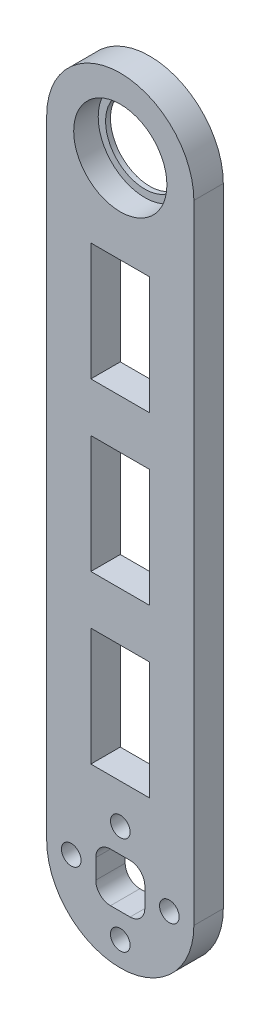
ISO-10303-21;
HEADER;
FILE_DESCRIPTION(('STEP AP214'),'2;1');
FILE_NAME('part.step','',(''),(''),'','','');
FILE_SCHEMA(('AUTOMOTIVE_DESIGN { 1 0 10303 214 1 1 1 1 }'));
ENDSEC;
DATA;
#1=APPLICATION_CONTEXT('core data for automotive mechanical design processes');
#2=APPLICATION_PROTOCOL_DEFINITION('international standard','automotive_design',2000,#1);
#3=PRODUCT_CONTEXT('',#1,'mechanical');
#4=PRODUCT('Part','Part','',(#3));
#5=PRODUCT_RELATED_PRODUCT_CATEGORY('part','',(#4));
#6=PRODUCT_DEFINITION_FORMATION('','',#4);
#7=PRODUCT_DEFINITION_CONTEXT('part definition',#1,'design');
#8=PRODUCT_DEFINITION('design','',#6,#7);
#9=PRODUCT_DEFINITION_SHAPE('','',#8);
#10=(LENGTH_UNIT() NAMED_UNIT(*) SI_UNIT(.MILLI.,.METRE.));
#11=(NAMED_UNIT(*) PLANE_ANGLE_UNIT() SI_UNIT($,.RADIAN.));
#12=(NAMED_UNIT(*) SI_UNIT($,.STERADIAN.) SOLID_ANGLE_UNIT());
#13=UNCERTAINTY_MEASURE_WITH_UNIT(LENGTH_MEASURE(1.E-05),#10,'distance_accuracy_value','');
#14=(GEOMETRIC_REPRESENTATION_CONTEXT(3) GLOBAL_UNCERTAINTY_ASSIGNED_CONTEXT((#13)) GLOBAL_UNIT_ASSIGNED_CONTEXT((#10,
#11,#12)) REPRESENTATION_CONTEXT('',''));
#15=CARTESIAN_POINT('',(0.,0.,0.));
#16=DIRECTION('',(0.,0.,1.));
#17=DIRECTION('',(1.,0.,0.));
#18=AXIS2_PLACEMENT_3D('',#15,#16,#17);
#19=CARTESIAN_POINT('',(0.,64.,6.));
#20=DIRECTION('',(0.,0.,-1.));
#21=DIRECTION('',(-1.,0.,0.));
#22=AXIS2_PLACEMENT_3D('',#19,#20,#21);
#23=CYLINDRICAL_SURFACE('',#22,9.5);
#24=CARTESIAN_POINT('',(0.,64.,6.));
#25=DIRECTION('',(0.,0.,1.));
#26=DIRECTION('',(1.,0.,0.));
#27=AXIS2_PLACEMENT_3D('',#24,#25,#26);
#28=CIRCLE('',#27,9.5);
#29=CARTESIAN_POINT('',(9.5,64.,6.));
#30=VERTEX_POINT('',#29);
#31=EDGE_CURVE('E356',#30,#30,#28,.T.);
#32=ORIENTED_EDGE('',*,*,#31,.T.);
#33=EDGE_LOOP('',(#32));
#34=FACE_BOUND('',#33,.T.);
#35=CARTESIAN_POINT('',(0.,64.,1.));
#36=DIRECTION('',(0.,0.,-1.));
#37=DIRECTION('',(-1.,0.,0.));
#38=AXIS2_PLACEMENT_3D('',#35,#36,#37);
#39=CIRCLE('',#38,9.5);
#40=CARTESIAN_POINT('',(-9.5,64.,1.));
#41=VERTEX_POINT('',#40);
#42=EDGE_CURVE('E234',#41,#41,#39,.T.);
#43=ORIENTED_EDGE('',*,*,#42,.T.);
#44=EDGE_LOOP('',(#43));
#45=FACE_BOUND('',#44,.T.);
#46=ADVANCED_FACE('F41',(#34,#45),#23,.F.);
#47=CARTESIAN_POINT('',(0.,64.,6.));
#48=DIRECTION('',(0.,0.,1.));
#49=DIRECTION('',(1.,0.,0.));
#50=AXIS2_PLACEMENT_3D('',#47,#48,#49);
#51=PLANE('',#50);
#52=DIRECTION('',(0.,1.,0.));
#53=VECTOR('',#52,1.);
#54=CARTESIAN_POINT('',(6.00000000000324,46.,6.));
#55=LINE('',#54,#53);
#56=CARTESIAN_POINT('',(6.00000000000325,22.,6.));
#57=VERTEX_POINT('',#56);
#58=CARTESIAN_POINT('',(6.00000000000324,46.,6.));
#59=VERTEX_POINT('',#58);
#60=EDGE_CURVE('E210',#57,#59,#55,.T.);
#61=ORIENTED_EDGE('',*,*,#60,.F.);
#62=DIRECTION('',(1.,0.,0.));
#63=VECTOR('',#62,1.);
#64=CARTESIAN_POINT('',(-5.99999999999675,22.,6.));
#65=LINE('',#64,#63);
#66=CARTESIAN_POINT('',(-5.99999999999675,22.,6.));
#67=VERTEX_POINT('',#66);
#68=EDGE_CURVE('E228',#67,#57,#65,.T.);
#69=ORIENTED_EDGE('',*,*,#68,.F.);
#70=DIRECTION('',(0.,-1.,0.));
#71=VECTOR('',#70,1.);
#72=CARTESIAN_POINT('',(-5.99999999999676,46.,6.));
#73=LINE('',#72,#71);
#74=CARTESIAN_POINT('',(-5.99999999999676,46.,6.));
#75=VERTEX_POINT('',#74);
#76=EDGE_CURVE('E231',#75,#67,#73,.T.);
#77=ORIENTED_EDGE('',*,*,#76,.F.);
#78=DIRECTION('',(-1.,0.,0.));
#79=VECTOR('',#78,1.);
#80=CARTESIAN_POINT('',(-5.99999999999676,46.,6.));
#81=LINE('',#80,#79);
#82=EDGE_CURVE('E240',#59,#75,#81,.T.);
#83=ORIENTED_EDGE('',*,*,#82,.F.);
#84=EDGE_LOOP('',(#61,#69,#77,#83));
#85=FACE_BOUND('',#84,.T.);
#86=DIRECTION('',(0.,1.,0.));
#87=VECTOR('',#86,1.);
#88=CARTESIAN_POINT('',(6.,12.,6.));
#89=LINE('',#88,#87);
#90=CARTESIAN_POINT('',(6.,-12.,6.));
#91=VERTEX_POINT('',#90);
#92=CARTESIAN_POINT('',(6.,12.,6.));
#93=VERTEX_POINT('',#92);
#94=EDGE_CURVE('E265',#91,#93,#89,.T.);
#95=ORIENTED_EDGE('',*,*,#94,.F.);
#96=DIRECTION('',(1.,0.,0.));
#97=VECTOR('',#96,1.);
#98=CARTESIAN_POINT('',(-6.,-12.,6.));
#99=LINE('',#98,#97);
#100=CARTESIAN_POINT('',(-6.,-12.,6.));
#101=VERTEX_POINT('',#100);
#102=EDGE_CURVE('E255',#101,#91,#99,.T.);
#103=ORIENTED_EDGE('',*,*,#102,.F.);
#104=DIRECTION('',(0.,-1.,0.));
#105=VECTOR('',#104,1.);
#106=CARTESIAN_POINT('',(-6.,12.,6.));
#107=LINE('',#106,#105);
#108=CARTESIAN_POINT('',(-6.,12.,6.));
#109=VERTEX_POINT('',#108);
#110=EDGE_CURVE('E271',#109,#101,#107,.T.);
#111=ORIENTED_EDGE('',*,*,#110,.F.);
#112=DIRECTION('',(-1.,0.,0.));
#113=VECTOR('',#112,1.);
#114=CARTESIAN_POINT('',(-6.,12.,6.));
#115=LINE('',#114,#113);
#116=EDGE_CURVE('E267',#93,#109,#115,.T.);
#117=ORIENTED_EDGE('',*,*,#116,.F.);
#118=EDGE_LOOP('',(#95,#103,#111,#117));
#119=FACE_BOUND('',#118,.T.);
#120=DIRECTION('',(0.,1.,0.));
#121=VECTOR('',#120,1.);
#122=CARTESIAN_POINT('',(6.00000000000325,-22.,6.));
#123=LINE('',#122,#121);
#124=CARTESIAN_POINT('',(6.00000000000325,-46.,6.));
#125=VERTEX_POINT('',#124);
#126=CARTESIAN_POINT('',(6.00000000000325,-22.,6.));
#127=VERTEX_POINT('',#126);
#128=EDGE_CURVE('E297',#125,#127,#123,.T.);
#129=ORIENTED_EDGE('',*,*,#128,.F.);
#130=DIRECTION('',(1.,0.,0.));
#131=VECTOR('',#130,1.);
#132=CARTESIAN_POINT('',(-5.99999999999675,-46.,6.));
#133=LINE('',#132,#131);
#134=CARTESIAN_POINT('',(-5.99999999999675,-46.,6.));
#135=VERTEX_POINT('',#134);
#136=EDGE_CURVE('E287',#135,#125,#133,.T.);
#137=ORIENTED_EDGE('',*,*,#136,.F.);
#138=DIRECTION('',(0.,-1.,0.));
#139=VECTOR('',#138,1.);
#140=CARTESIAN_POINT('',(-5.99999999999675,-22.,6.));
#141=LINE('',#140,#139);
#142=CARTESIAN_POINT('',(-5.99999999999675,-22.,6.));
#143=VERTEX_POINT('',#142);
#144=EDGE_CURVE('E303',#143,#135,#141,.T.);
#145=ORIENTED_EDGE('',*,*,#144,.F.);
#146=DIRECTION('',(-1.,0.,0.));
#147=VECTOR('',#146,1.);
#148=CARTESIAN_POINT('',(-5.99999999999675,-22.,6.));
#149=LINE('',#148,#147);
#150=EDGE_CURVE('E299',#127,#143,#149,.T.);
#151=ORIENTED_EDGE('',*,*,#150,.F.);
#152=EDGE_LOOP('',(#129,#137,#145,#151));
#153=FACE_BOUND('',#152,.T.);
#154=DIRECTION('',(0.,1.,0.));
#155=VECTOR('',#154,1.);
#156=CARTESIAN_POINT('',(5.,-69.,6.));
#157=LINE('',#156,#155);
#158=CARTESIAN_POINT('',(5.,-66.,6.));
#159=VERTEX_POINT('',#158);
#160=CARTESIAN_POINT('',(5.,-62.,6.));
#161=VERTEX_POINT('',#160);
#162=EDGE_CURVE('E325',#159,#161,#157,.T.);
#163=ORIENTED_EDGE('',*,*,#162,.F.);
#164=CARTESIAN_POINT('',(2.,-66.,6.));
#165=DIRECTION('',(0.,0.,1.));
#166=DIRECTION('',(1.,0.,0.));
#167=AXIS2_PLACEMENT_3D('',#164,#165,#166);
#168=CIRCLE('',#167,3.);
#169=CARTESIAN_POINT('',(2.,-69.,6.));
#170=VERTEX_POINT('',#169);
#171=EDGE_CURVE('E414',#159,#170,#168,.F.);
#172=ORIENTED_EDGE('',*,*,#171,.T.);
#173=DIRECTION('',(1.,0.,0.));
#174=VECTOR('',#173,1.);
#175=CARTESIAN_POINT('',(-5.,-69.,6.));
#176=LINE('',#175,#174);
#177=CARTESIAN_POINT('',(-2.,-69.,6.));
#178=VERTEX_POINT('',#177);
#179=EDGE_CURVE('E318',#178,#170,#176,.T.);
#180=ORIENTED_EDGE('',*,*,#179,.F.);
#181=CARTESIAN_POINT('',(-2.,-66.,6.));
#182=DIRECTION('',(0.,0.,1.));
#183=DIRECTION('',(1.,0.,0.));
#184=AXIS2_PLACEMENT_3D('',#181,#182,#183);
#185=CIRCLE('',#184,3.);
#186=CARTESIAN_POINT('',(-5.,-66.,6.));
#187=VERTEX_POINT('',#186);
#188=EDGE_CURVE('E410',#178,#187,#185,.F.);
#189=ORIENTED_EDGE('',*,*,#188,.T.);
#190=DIRECTION('',(0.,-1.,0.));
#191=VECTOR('',#190,1.);
#192=CARTESIAN_POINT('',(-5.,-69.,6.));
#193=LINE('',#192,#191);
#194=CARTESIAN_POINT('',(-5.,-62.,6.));
#195=VERTEX_POINT('',#194);
#196=EDGE_CURVE('E330',#195,#187,#193,.T.);
#197=ORIENTED_EDGE('',*,*,#196,.F.);
#198=CARTESIAN_POINT('',(-2.,-62.,6.));
#199=DIRECTION('',(0.,0.,1.));
#200=DIRECTION('',(1.,0.,0.));
#201=AXIS2_PLACEMENT_3D('',#198,#199,#200);
#202=CIRCLE('',#201,3.);
#203=CARTESIAN_POINT('',(-2.,-59.,6.));
#204=VERTEX_POINT('',#203);
#205=EDGE_CURVE('E49',#195,#204,#202,.F.);
#206=ORIENTED_EDGE('',*,*,#205,.T.);
#207=DIRECTION('',(-1.,0.,0.));
#208=VECTOR('',#207,1.);
#209=CARTESIAN_POINT('',(-5.,-59.,6.));
#210=LINE('',#209,#208);
#211=CARTESIAN_POINT('',(2.,-59.,6.));
#212=VERTEX_POINT('',#211);
#213=EDGE_CURVE('E328',#212,#204,#210,.T.);
#214=ORIENTED_EDGE('',*,*,#213,.F.);
#215=CARTESIAN_POINT('',(2.,-62.,6.));
#216=DIRECTION('',(0.,0.,1.));
#217=DIRECTION('',(1.,0.,0.));
#218=AXIS2_PLACEMENT_3D('',#215,#216,#217);
#219=CIRCLE('',#218,3.);
#220=EDGE_CURVE('E418',#212,#161,#219,.F.);
#221=ORIENTED_EDGE('',*,*,#220,.T.);
#222=EDGE_LOOP('',(#163,#172,#180,#189,#197,#206,#214,#221));
#223=FACE_BOUND('',#222,.T.);
#224=CARTESIAN_POINT('',(2.09488880330588E-13,-74.,6.));
#225=DIRECTION('',(0.,0.,1.));
#226=DIRECTION('',(1.,0.,0.));
#227=AXIS2_PLACEMENT_3D('',#224,#225,#226);
#228=CIRCLE('',#227,2.);
#229=CARTESIAN_POINT('',(2.00000000000021,-74.,6.));
#230=VERTEX_POINT('',#229);
#231=EDGE_CURVE('E341',#230,#230,#228,.T.);
#232=ORIENTED_EDGE('',*,*,#231,.F.);
#233=EDGE_LOOP('',(#232));
#234=FACE_BOUND('',#233,.T.);
#235=CARTESIAN_POINT('',(0.,-54.,6.));
#236=DIRECTION('',(0.,0.,1.));
#237=DIRECTION('',(1.,0.,0.));
#238=AXIS2_PLACEMENT_3D('',#235,#236,#237);
#239=CIRCLE('',#238,2.);
#240=CARTESIAN_POINT('',(2.,-54.,6.));
#241=VERTEX_POINT('',#240);
#242=EDGE_CURVE('E353',#241,#241,#239,.T.);
#243=ORIENTED_EDGE('',*,*,#242,.F.);
#244=EDGE_LOOP('',(#243));
#245=FACE_BOUND('',#244,.T.);
#246=CARTESIAN_POINT('',(0.,64.,6.));
#247=DIRECTION('',(0.,0.,1.));
#248=DIRECTION('',(1.,0.,0.));
#249=AXIS2_PLACEMENT_3D('',#246,#247,#248);
#250=CIRCLE('',#249,15.);
#251=CARTESIAN_POINT('',(15.,64.,6.));
#252=VERTEX_POINT('',#251);
#253=CARTESIAN_POINT('',(-15.,64.,6.));
#254=VERTEX_POINT('',#253);
#255=EDGE_CURVE('E362',#252,#254,#250,.T.);
#256=ORIENTED_EDGE('',*,*,#255,.T.);
#257=DIRECTION('',(0.,-1.,0.));
#258=VECTOR('',#257,1.);
#259=CARTESIAN_POINT('',(-15.,-64.,6.));
#260=LINE('',#259,#258);
#261=CARTESIAN_POINT('',(-15.,-64.,6.));
#262=VERTEX_POINT('',#261);
#263=EDGE_CURVE('E365',#254,#262,#260,.T.);
#264=ORIENTED_EDGE('',*,*,#263,.T.);
#265=CARTESIAN_POINT('',(0.,-64.,6.));
#266=DIRECTION('',(0.,0.,1.));
#267=DIRECTION('',(1.,0.,0.));
#268=AXIS2_PLACEMENT_3D('',#265,#266,#267);
#269=CIRCLE('',#268,15.);
#270=CARTESIAN_POINT('',(15.,-64.,6.));
#271=VERTEX_POINT('',#270);
#272=EDGE_CURVE('E368',#262,#271,#269,.T.);
#273=ORIENTED_EDGE('',*,*,#272,.T.);
#274=DIRECTION('',(0.,1.,0.));
#275=VECTOR('',#274,1.);
#276=CARTESIAN_POINT('',(15.,-64.,6.));
#277=LINE('',#276,#275);
#278=EDGE_CURVE('E370',#271,#252,#277,.T.);
#279=ORIENTED_EDGE('',*,*,#278,.T.);
#280=EDGE_LOOP('',(#256,#264,#273,#279));
#281=FACE_BOUND('',#280,.T.);
#282=ORIENTED_EDGE('',*,*,#31,.F.);
#283=EDGE_LOOP('',(#282));
#284=FACE_BOUND('',#283,.T.);
#285=CARTESIAN_POINT('',(10.0000000000002,-63.9999999999999,6.));
#286=DIRECTION('',(0.,0.,1.));
#287=DIRECTION('',(1.,0.,0.));
#288=AXIS2_PLACEMENT_3D('',#285,#286,#287);
#289=CIRCLE('',#288,2.00000000000001);
#290=CARTESIAN_POINT('',(12.0000000000002,-63.9999999999999,6.));
#291=VERTEX_POINT('',#290);
#292=EDGE_CURVE('E347',#291,#291,#289,.T.);
#293=ORIENTED_EDGE('',*,*,#292,.F.);
#294=EDGE_LOOP('',(#293));
#295=FACE_BOUND('',#294,.T.);
#296=CARTESIAN_POINT('',(-9.99999999999986,-64.,6.));
#297=DIRECTION('',(0.,0.,1.));
#298=DIRECTION('',(1.,0.,0.));
#299=AXIS2_PLACEMENT_3D('',#296,#297,#298);
#300=CIRCLE('',#299,2.);
#301=CARTESIAN_POINT('',(-7.99999999999986,-64.,6.));
#302=VERTEX_POINT('',#301);
#303=EDGE_CURVE('E335',#302,#302,#300,.T.);
#304=ORIENTED_EDGE('',*,*,#303,.F.);
#305=EDGE_LOOP('',(#304));
#306=FACE_BOUND('',#305,.T.);
#307=ADVANCED_FACE('F424',(#85,#119,#153,#223,#234,#245,#281,#284,#295,#306),#51,.T.);
#308=CARTESIAN_POINT('',(0.,64.,0.));
#309=DIRECTION('',(0.,0.,1.));
#310=DIRECTION('',(1.,0.,0.));
#311=AXIS2_PLACEMENT_3D('',#308,#309,#310);
#312=PLANE('',#311);
#313=DIRECTION('',(1.,0.,0.));
#314=VECTOR('',#313,1.);
#315=CARTESIAN_POINT('',(-5.99999999999675,22.,0.));
#316=LINE('',#315,#314);
#317=CARTESIAN_POINT('',(-5.99999999999675,22.,0.));
#318=VERTEX_POINT('',#317);
#319=CARTESIAN_POINT('',(6.00000000000325,22.,0.));
#320=VERTEX_POINT('',#319);
#321=EDGE_CURVE('E215',#318,#320,#316,.T.);
#322=ORIENTED_EDGE('',*,*,#321,.T.);
#323=DIRECTION('',(0.,1.,0.));
#324=VECTOR('',#323,1.);
#325=CARTESIAN_POINT('',(6.00000000000324,46.,0.));
#326=LINE('',#325,#324);
#327=CARTESIAN_POINT('',(6.00000000000324,46.,0.));
#328=VERTEX_POINT('',#327);
#329=EDGE_CURVE('E207',#320,#328,#326,.T.);
#330=ORIENTED_EDGE('',*,*,#329,.T.);
#331=DIRECTION('',(-1.,0.,0.));
#332=VECTOR('',#331,1.);
#333=CARTESIAN_POINT('',(-5.99999999999676,46.,0.));
#334=LINE('',#333,#332);
#335=CARTESIAN_POINT('',(-5.99999999999676,46.,0.));
#336=VERTEX_POINT('',#335);
#337=EDGE_CURVE('E219',#328,#336,#334,.T.);
#338=ORIENTED_EDGE('',*,*,#337,.T.);
#339=DIRECTION('',(0.,-1.,0.));
#340=VECTOR('',#339,1.);
#341=CARTESIAN_POINT('',(-5.99999999999676,46.,0.));
#342=LINE('',#341,#340);
#343=EDGE_CURVE('E223',#336,#318,#342,.T.);
#344=ORIENTED_EDGE('',*,*,#343,.T.);
#345=EDGE_LOOP('',(#322,#330,#338,#344));
#346=FACE_BOUND('',#345,.T.);
#347=DIRECTION('',(1.,0.,0.));
#348=VECTOR('',#347,1.);
#349=CARTESIAN_POINT('',(-6.,-12.,0.));
#350=LINE('',#349,#348);
#351=CARTESIAN_POINT('',(-6.,-12.,0.));
#352=VERTEX_POINT('',#351);
#353=CARTESIAN_POINT('',(6.,-12.,0.));
#354=VERTEX_POINT('',#353);
#355=EDGE_CURVE('E261',#352,#354,#350,.T.);
#356=ORIENTED_EDGE('',*,*,#355,.T.);
#357=DIRECTION('',(0.,1.,0.));
#358=VECTOR('',#357,1.);
#359=CARTESIAN_POINT('',(6.,12.,0.));
#360=LINE('',#359,#358);
#361=CARTESIAN_POINT('',(6.,12.,0.));
#362=VERTEX_POINT('',#361);
#363=EDGE_CURVE('E251',#354,#362,#360,.T.);
#364=ORIENTED_EDGE('',*,*,#363,.T.);
#365=DIRECTION('',(-1.,0.,0.));
#366=VECTOR('',#365,1.);
#367=CARTESIAN_POINT('',(-6.,12.,0.));
#368=LINE('',#367,#366);
#369=CARTESIAN_POINT('',(-6.,12.,0.));
#370=VERTEX_POINT('',#369);
#371=EDGE_CURVE('E254',#362,#370,#368,.T.);
#372=ORIENTED_EDGE('',*,*,#371,.T.);
#373=DIRECTION('',(0.,-1.,0.));
#374=VECTOR('',#373,1.);
#375=CARTESIAN_POINT('',(-6.,12.,0.));
#376=LINE('',#375,#374);
#377=EDGE_CURVE('E258',#370,#352,#376,.T.);
#378=ORIENTED_EDGE('',*,*,#377,.T.);
#379=EDGE_LOOP('',(#356,#364,#372,#378));
#380=FACE_BOUND('',#379,.T.);
#381=DIRECTION('',(1.,0.,0.));
#382=VECTOR('',#381,1.);
#383=CARTESIAN_POINT('',(-5.99999999999675,-46.,0.));
#384=LINE('',#383,#382);
#385=CARTESIAN_POINT('',(-5.99999999999675,-46.,0.));
#386=VERTEX_POINT('',#385);
#387=CARTESIAN_POINT('',(6.00000000000325,-46.,0.));
#388=VERTEX_POINT('',#387);
#389=EDGE_CURVE('E293',#386,#388,#384,.T.);
#390=ORIENTED_EDGE('',*,*,#389,.T.);
#391=DIRECTION('',(0.,1.,0.));
#392=VECTOR('',#391,1.);
#393=CARTESIAN_POINT('',(6.00000000000325,-22.,0.));
#394=LINE('',#393,#392);
#395=CARTESIAN_POINT('',(6.00000000000325,-22.,0.));
#396=VERTEX_POINT('',#395);
#397=EDGE_CURVE('E283',#388,#396,#394,.T.);
#398=ORIENTED_EDGE('',*,*,#397,.T.);
#399=DIRECTION('',(-1.,0.,0.));
#400=VECTOR('',#399,1.);
#401=CARTESIAN_POINT('',(-5.99999999999675,-22.,0.));
#402=LINE('',#401,#400);
#403=CARTESIAN_POINT('',(-5.99999999999675,-22.,0.));
#404=VERTEX_POINT('',#403);
#405=EDGE_CURVE('E286',#396,#404,#402,.T.);
#406=ORIENTED_EDGE('',*,*,#405,.T.);
#407=DIRECTION('',(0.,-1.,0.));
#408=VECTOR('',#407,1.);
#409=CARTESIAN_POINT('',(-5.99999999999675,-22.,0.));
#410=LINE('',#409,#408);
#411=EDGE_CURVE('E290',#404,#386,#410,.T.);
#412=ORIENTED_EDGE('',*,*,#411,.T.);
#413=EDGE_LOOP('',(#390,#398,#406,#412));
#414=FACE_BOUND('',#413,.T.);
#415=DIRECTION('',(0.,-1.,0.));
#416=VECTOR('',#415,1.);
#417=CARTESIAN_POINT('',(-5.,-69.,0.));
#418=LINE('',#417,#416);
#419=CARTESIAN_POINT('',(-5.,-62.,0.));
#420=VERTEX_POINT('',#419);
#421=CARTESIAN_POINT('',(-5.,-66.,0.));
#422=VERTEX_POINT('',#421);
#423=EDGE_CURVE('E320',#420,#422,#418,.T.);
#424=ORIENTED_EDGE('',*,*,#423,.T.);
#425=CARTESIAN_POINT('',(-2.,-66.,0.));
#426=DIRECTION('',(0.,0.,1.));
#427=DIRECTION('',(1.,0.,0.));
#428=AXIS2_PLACEMENT_3D('',#425,#426,#427);
#429=CIRCLE('',#428,3.);
#430=CARTESIAN_POINT('',(-2.,-69.,0.));
#431=VERTEX_POINT('',#430);
#432=EDGE_CURVE('E412',#422,#431,#429,.T.);
#433=ORIENTED_EDGE('',*,*,#432,.T.);
#434=DIRECTION('',(1.,0.,0.));
#435=VECTOR('',#434,1.);
#436=CARTESIAN_POINT('',(-5.,-69.,0.));
#437=LINE('',#436,#435);
#438=CARTESIAN_POINT('',(2.,-69.,0.));
#439=VERTEX_POINT('',#438);
#440=EDGE_CURVE('E300',#431,#439,#437,.T.);
#441=ORIENTED_EDGE('',*,*,#440,.T.);
#442=CARTESIAN_POINT('',(2.,-66.,0.));
#443=DIRECTION('',(0.,0.,1.));
#444=DIRECTION('',(1.,0.,0.));
#445=AXIS2_PLACEMENT_3D('',#442,#443,#444);
#446=CIRCLE('',#445,3.);
#447=CARTESIAN_POINT('',(5.,-66.,0.));
#448=VERTEX_POINT('',#447);
#449=EDGE_CURVE('E416',#439,#448,#446,.T.);
#450=ORIENTED_EDGE('',*,*,#449,.T.);
#451=DIRECTION('',(0.,1.,0.));
#452=VECTOR('',#451,1.);
#453=CARTESIAN_POINT('',(5.,-69.,0.));
#454=LINE('',#453,#452);
#455=CARTESIAN_POINT('',(5.,-62.,0.));
#456=VERTEX_POINT('',#455);
#457=EDGE_CURVE('E315',#448,#456,#454,.T.);
#458=ORIENTED_EDGE('',*,*,#457,.T.);
#459=CARTESIAN_POINT('',(2.,-62.,0.));
#460=DIRECTION('',(0.,0.,1.));
#461=DIRECTION('',(1.,0.,0.));
#462=AXIS2_PLACEMENT_3D('',#459,#460,#461);
#463=CIRCLE('',#462,3.);
#464=CARTESIAN_POINT('',(2.,-59.,0.));
#465=VERTEX_POINT('',#464);
#466=EDGE_CURVE('E63',#456,#465,#463,.T.);
#467=ORIENTED_EDGE('',*,*,#466,.T.);
#468=DIRECTION('',(-1.,0.,0.));
#469=VECTOR('',#468,1.);
#470=CARTESIAN_POINT('',(-5.,-59.,0.));
#471=LINE('',#470,#469);
#472=CARTESIAN_POINT('',(-2.,-59.,0.));
#473=VERTEX_POINT('',#472);
#474=EDGE_CURVE('E317',#465,#473,#471,.T.);
#475=ORIENTED_EDGE('',*,*,#474,.T.);
#476=CARTESIAN_POINT('',(-2.,-62.,0.));
#477=DIRECTION('',(0.,0.,1.));
#478=DIRECTION('',(1.,0.,0.));
#479=AXIS2_PLACEMENT_3D('',#476,#477,#478);
#480=CIRCLE('',#479,3.);
#481=EDGE_CURVE('E11',#473,#420,#480,.T.);
#482=ORIENTED_EDGE('',*,*,#481,.T.);
#483=EDGE_LOOP('',(#424,#433,#441,#450,#458,#467,#475,#482));
#484=FACE_BOUND('',#483,.T.);
#485=CARTESIAN_POINT('',(0.,64.,0.));
#486=DIRECTION('',(0.,0.,1.));
#487=DIRECTION('',(1.,0.,0.));
#488=AXIS2_PLACEMENT_3D('',#485,#486,#487);
#489=CIRCLE('',#488,15.);
#490=CARTESIAN_POINT('',(15.,64.,0.));
#491=VERTEX_POINT('',#490);
#492=CARTESIAN_POINT('',(-15.,64.,0.));
#493=VERTEX_POINT('',#492);
#494=EDGE_CURVE('E361',#491,#493,#489,.T.);
#495=ORIENTED_EDGE('',*,*,#494,.F.);
#496=DIRECTION('',(0.,1.,0.));
#497=VECTOR('',#496,1.);
#498=CARTESIAN_POINT('',(15.,-64.,0.));
#499=LINE('',#498,#497);
#500=CARTESIAN_POINT('',(15.,-64.,0.));
#501=VERTEX_POINT('',#500);
#502=EDGE_CURVE('E366',#501,#491,#499,.T.);
#503=ORIENTED_EDGE('',*,*,#502,.F.);
#504=CARTESIAN_POINT('',(0.,-64.,0.));
#505=DIRECTION('',(0.,0.,1.));
#506=DIRECTION('',(1.,0.,0.));
#507=AXIS2_PLACEMENT_3D('',#504,#505,#506);
#508=CIRCLE('',#507,15.);
#509=CARTESIAN_POINT('',(-15.,-64.,0.));
#510=VERTEX_POINT('',#509);
#511=EDGE_CURVE('E377',#510,#501,#508,.T.);
#512=ORIENTED_EDGE('',*,*,#511,.F.);
#513=DIRECTION('',(0.,-1.,0.));
#514=VECTOR('',#513,1.);
#515=CARTESIAN_POINT('',(-15.,-64.,0.));
#516=LINE('',#515,#514);
#517=EDGE_CURVE('E375',#493,#510,#516,.T.);
#518=ORIENTED_EDGE('',*,*,#517,.F.);
#519=EDGE_LOOP('',(#495,#503,#512,#518));
#520=FACE_BOUND('',#519,.T.);
#521=CARTESIAN_POINT('',(0.,-54.,0.));
#522=DIRECTION('',(0.,0.,1.));
#523=DIRECTION('',(1.,0.,0.));
#524=AXIS2_PLACEMENT_3D('',#521,#522,#523);
#525=CIRCLE('',#524,2.);
#526=CARTESIAN_POINT('',(2.,-54.,0.));
#527=VERTEX_POINT('',#526);
#528=EDGE_CURVE('E350',#527,#527,#525,.T.);
#529=ORIENTED_EDGE('',*,*,#528,.T.);
#530=EDGE_LOOP('',(#529));
#531=FACE_BOUND('',#530,.T.);
#532=CARTESIAN_POINT('',(10.0000000000002,-63.9999999999999,0.));
#533=DIRECTION('',(0.,0.,1.));
#534=DIRECTION('',(1.,0.,0.));
#535=AXIS2_PLACEMENT_3D('',#532,#533,#534);
#536=CIRCLE('',#535,2.00000000000001);
#537=CARTESIAN_POINT('',(12.0000000000002,-63.9999999999999,0.));
#538=VERTEX_POINT('',#537);
#539=EDGE_CURVE('E344',#538,#538,#536,.T.);
#540=ORIENTED_EDGE('',*,*,#539,.T.);
#541=EDGE_LOOP('',(#540));
#542=FACE_BOUND('',#541,.T.);
#543=CARTESIAN_POINT('',(2.09488880330588E-13,-74.,0.));
#544=DIRECTION('',(0.,0.,1.));
#545=DIRECTION('',(1.,0.,0.));
#546=AXIS2_PLACEMENT_3D('',#543,#544,#545);
#547=CIRCLE('',#546,2.);
#548=CARTESIAN_POINT('',(2.00000000000021,-74.,0.));
#549=VERTEX_POINT('',#548);
#550=EDGE_CURVE('E338',#549,#549,#547,.T.);
#551=ORIENTED_EDGE('',*,*,#550,.T.);
#552=EDGE_LOOP('',(#551));
#553=FACE_BOUND('',#552,.T.);
#554=CARTESIAN_POINT('',(-9.99999999999986,-64.,0.));
#555=DIRECTION('',(0.,0.,1.));
#556=DIRECTION('',(1.,0.,0.));
#557=AXIS2_PLACEMENT_3D('',#554,#555,#556);
#558=CIRCLE('',#557,2.);
#559=CARTESIAN_POINT('',(-7.99999999999986,-64.,0.));
#560=VERTEX_POINT('',#559);
#561=EDGE_CURVE('E247',#560,#560,#558,.T.);
#562=ORIENTED_EDGE('',*,*,#561,.T.);
#563=EDGE_LOOP('',(#562));
#564=FACE_BOUND('',#563,.T.);
#565=CARTESIAN_POINT('',(0.,64.,0.));
#566=DIRECTION('',(0.,0.,-1.));
#567=DIRECTION('',(-1.,0.,0.));
#568=AXIS2_PLACEMENT_3D('',#565,#566,#567);
#569=CIRCLE('',#568,8.);
#570=CARTESIAN_POINT('',(-8.,64.,0.));
#571=VERTEX_POINT('',#570);
#572=EDGE_CURVE('E574',#571,#571,#569,.T.);
#573=ORIENTED_EDGE('',*,*,#572,.F.);
#574=EDGE_LOOP('',(#573));
#575=FACE_BOUND('',#574,.T.);
#576=ADVANCED_FACE('F225',(#346,#380,#414,#484,#520,#531,#542,#553,#564,#575),#312,.F.);
#577=CARTESIAN_POINT('',(0.,64.,6.));
#578=DIRECTION('',(0.,0.,-1.));
#579=DIRECTION('',(-1.,0.,0.));
#580=AXIS2_PLACEMENT_3D('',#577,#578,#579);
#581=CYLINDRICAL_SURFACE('',#580,15.);
#582=ORIENTED_EDGE('',*,*,#494,.T.);
#583=DIRECTION('',(0.,0.,-1.));
#584=VECTOR('',#583,1.);
#585=CARTESIAN_POINT('',(-15.,64.,6.));
#586=LINE('',#585,#584);
#587=EDGE_CURVE('E388',#254,#493,#586,.T.);
#588=ORIENTED_EDGE('',*,*,#587,.F.);
#589=ORIENTED_EDGE('',*,*,#255,.F.);
#590=DIRECTION('',(0.,0.,-1.));
#591=VECTOR('',#590,1.);
#592=CARTESIAN_POINT('',(15.,64.,6.));
#593=LINE('',#592,#591);
#594=EDGE_CURVE('E372',#252,#491,#593,.T.);
#595=ORIENTED_EDGE('',*,*,#594,.T.);
#596=EDGE_LOOP('',(#582,#588,#589,#595));
#597=FACE_BOUND('',#596,.T.);
#598=ADVANCED_FACE('F477',(#597),#581,.T.);
#599=CARTESIAN_POINT('',(-15.,-64.,6.));
#600=DIRECTION('',(1.,0.,0.));
#601=DIRECTION('',(0.,0.,-1.));
#602=AXIS2_PLACEMENT_3D('',#599,#600,#601);
#603=PLANE('',#602);
#604=ORIENTED_EDGE('',*,*,#517,.T.);
#605=DIRECTION('',(0.,0.,-1.));
#606=VECTOR('',#605,1.);
#607=CARTESIAN_POINT('',(-15.,-64.,6.));
#608=LINE('',#607,#606);
#609=EDGE_CURVE('E385',#262,#510,#608,.T.);
#610=ORIENTED_EDGE('',*,*,#609,.F.);
#611=ORIENTED_EDGE('',*,*,#263,.F.);
#612=ORIENTED_EDGE('',*,*,#587,.T.);
#613=EDGE_LOOP('',(#604,#610,#611,#612));
#614=FACE_BOUND('',#613,.T.);
#615=ADVANCED_FACE('F485',(#614),#603,.F.);
#616=CARTESIAN_POINT('',(0.,-64.,6.));
#617=DIRECTION('',(0.,0.,-1.));
#618=DIRECTION('',(-1.,0.,0.));
#619=AXIS2_PLACEMENT_3D('',#616,#617,#618);
#620=CYLINDRICAL_SURFACE('',#619,15.);
#621=ORIENTED_EDGE('',*,*,#511,.T.);
#622=DIRECTION('',(0.,0.,-1.));
#623=VECTOR('',#622,1.);
#624=CARTESIAN_POINT('',(15.,-64.,6.));
#625=LINE('',#624,#623);
#626=EDGE_CURVE('E382',#271,#501,#625,.T.);
#627=ORIENTED_EDGE('',*,*,#626,.F.);
#628=ORIENTED_EDGE('',*,*,#272,.F.);
#629=ORIENTED_EDGE('',*,*,#609,.T.);
#630=EDGE_LOOP('',(#621,#627,#628,#629));
#631=FACE_BOUND('',#630,.T.);
#632=ADVANCED_FACE('F481',(#631),#620,.T.);
#633=CARTESIAN_POINT('',(15.,-64.,6.));
#634=DIRECTION('',(-1.,0.,0.));
#635=DIRECTION('',(0.,0.,1.));
#636=AXIS2_PLACEMENT_3D('',#633,#634,#635);
#637=PLANE('',#636);
#638=ORIENTED_EDGE('',*,*,#502,.T.);
#639=ORIENTED_EDGE('',*,*,#594,.F.);
#640=ORIENTED_EDGE('',*,*,#278,.F.);
#641=ORIENTED_EDGE('',*,*,#626,.T.);
#642=EDGE_LOOP('',(#638,#639,#640,#641));
#643=FACE_BOUND('',#642,.T.);
#644=ADVANCED_FACE('F478',(#643),#637,.F.);
#645=CARTESIAN_POINT('',(0.,-54.,6.));
#646=DIRECTION('',(0.,0.,-1.));
#647=DIRECTION('',(-1.,0.,0.));
#648=AXIS2_PLACEMENT_3D('',#645,#646,#647);
#649=CYLINDRICAL_SURFACE('',#648,2.);
#650=ORIENTED_EDGE('',*,*,#242,.T.);
#651=EDGE_LOOP('',(#650));
#652=FACE_BOUND('',#651,.T.);
#653=ORIENTED_EDGE('',*,*,#528,.F.);
#654=EDGE_LOOP('',(#653));
#655=FACE_BOUND('',#654,.T.);
#656=ADVANCED_FACE('F473',(#652,#655),#649,.F.);
#657=CARTESIAN_POINT('',(10.0000000000002,-63.9999999999999,6.));
#658=DIRECTION('',(0.,0.,-1.));
#659=DIRECTION('',(-1.,0.,0.));
#660=AXIS2_PLACEMENT_3D('',#657,#658,#659);
#661=CYLINDRICAL_SURFACE('',#660,2.00000000000001);
#662=ORIENTED_EDGE('',*,*,#292,.T.);
#663=EDGE_LOOP('',(#662));
#664=FACE_BOUND('',#663,.T.);
#665=ORIENTED_EDGE('',*,*,#539,.F.);
#666=EDGE_LOOP('',(#665));
#667=FACE_BOUND('',#666,.T.);
#668=ADVANCED_FACE('F555',(#664,#667),#661,.F.);
#669=CARTESIAN_POINT('',(2.09488880330588E-13,-74.,6.));
#670=DIRECTION('',(0.,0.,-1.));
#671=DIRECTION('',(-1.,0.,0.));
#672=AXIS2_PLACEMENT_3D('',#669,#670,#671);
#673=CYLINDRICAL_SURFACE('',#672,2.);
#674=ORIENTED_EDGE('',*,*,#231,.T.);
#675=EDGE_LOOP('',(#674));
#676=FACE_BOUND('',#675,.T.);
#677=ORIENTED_EDGE('',*,*,#550,.F.);
#678=EDGE_LOOP('',(#677));
#679=FACE_BOUND('',#678,.T.);
#680=ADVANCED_FACE('F552',(#676,#679),#673,.F.);
#681=CARTESIAN_POINT('',(-9.99999999999986,-64.,6.));
#682=DIRECTION('',(0.,0.,-1.));
#683=DIRECTION('',(-1.,0.,0.));
#684=AXIS2_PLACEMENT_3D('',#681,#682,#683);
#685=CYLINDRICAL_SURFACE('',#684,2.);
#686=ORIENTED_EDGE('',*,*,#303,.T.);
#687=EDGE_LOOP('',(#686));
#688=FACE_BOUND('',#687,.T.);
#689=ORIENTED_EDGE('',*,*,#561,.F.);
#690=EDGE_LOOP('',(#689));
#691=FACE_BOUND('',#690,.T.);
#692=ADVANCED_FACE('F549',(#688,#691),#685,.F.);
#693=CARTESIAN_POINT('',(5.,-69.,0.));
#694=DIRECTION('',(1.,0.,0.));
#695=DIRECTION('',(0.,0.,-1.));
#696=AXIS2_PLACEMENT_3D('',#693,#694,#695);
#697=PLANE('',#696);
#698=ORIENTED_EDGE('',*,*,#457,.F.);
#699=DIRECTION('',(0.,0.,1.));
#700=VECTOR('',#699,1.);
#701=CARTESIAN_POINT('',(5.,-66.,6.));
#702=LINE('',#701,#700);
#703=EDGE_CURVE('E403',#448,#159,#702,.T.);
#704=ORIENTED_EDGE('',*,*,#703,.T.);
#705=ORIENTED_EDGE('',*,*,#162,.T.);
#706=DIRECTION('',(0.,0.,1.));
#707=VECTOR('',#706,1.);
#708=CARTESIAN_POINT('',(5.,-62.,0.));
#709=LINE('',#708,#707);
#710=EDGE_CURVE('E401',#161,#456,#709,.F.);
#711=ORIENTED_EDGE('',*,*,#710,.T.);
#712=EDGE_LOOP('',(#698,#704,#705,#711));
#713=FACE_BOUND('',#712,.T.);
#714=ADVANCED_FACE('F451',(#713),#697,.F.);
#715=CARTESIAN_POINT('',(-5.,-69.,0.));
#716=DIRECTION('',(0.,-1.,0.));
#717=DIRECTION('',(0.,0.,-1.));
#718=AXIS2_PLACEMENT_3D('',#715,#716,#717);
#719=PLANE('',#718);
#720=ORIENTED_EDGE('',*,*,#440,.F.);
#721=DIRECTION('',(0.,0.,1.));
#722=VECTOR('',#721,1.);
#723=CARTESIAN_POINT('',(-2.,-69.,6.));
#724=LINE('',#723,#722);
#725=EDGE_CURVE('E393',#431,#178,#724,.T.);
#726=ORIENTED_EDGE('',*,*,#725,.T.);
#727=ORIENTED_EDGE('',*,*,#179,.T.);
#728=DIRECTION('',(0.,0.,1.));
#729=VECTOR('',#728,1.);
#730=CARTESIAN_POINT('',(2.,-69.,0.));
#731=LINE('',#730,#729);
#732=EDGE_CURVE('E391',#170,#439,#731,.F.);
#733=ORIENTED_EDGE('',*,*,#732,.T.);
#734=EDGE_LOOP('',(#720,#726,#727,#733));
#735=FACE_BOUND('',#734,.T.);
#736=ADVANCED_FACE('F443',(#735),#719,.F.);
#737=CARTESIAN_POINT('',(-5.,-69.,0.));
#738=DIRECTION('',(-1.,0.,0.));
#739=DIRECTION('',(0.,0.,1.));
#740=AXIS2_PLACEMENT_3D('',#737,#738,#739);
#741=PLANE('',#740);
#742=ORIENTED_EDGE('',*,*,#196,.T.);
#743=DIRECTION('',(0.,0.,1.));
#744=VECTOR('',#743,1.);
#745=CARTESIAN_POINT('',(-5.,-66.,0.));
#746=LINE('',#745,#744);
#747=EDGE_CURVE('E399',#187,#422,#746,.F.);
#748=ORIENTED_EDGE('',*,*,#747,.T.);
#749=ORIENTED_EDGE('',*,*,#423,.F.);
#750=DIRECTION('',(0.,0.,1.));
#751=VECTOR('',#750,1.);
#752=CARTESIAN_POINT('',(-5.,-62.,6.));
#753=LINE('',#752,#751);
#754=EDGE_CURVE('E396',#420,#195,#753,.T.);
#755=ORIENTED_EDGE('',*,*,#754,.T.);
#756=EDGE_LOOP('',(#742,#748,#749,#755));
#757=FACE_BOUND('',#756,.T.);
#758=ADVANCED_FACE('F435',(#757),#741,.F.);
#759=CARTESIAN_POINT('',(-5.,-59.,0.));
#760=DIRECTION('',(0.,1.,0.));
#761=DIRECTION('',(0.,0.,1.));
#762=AXIS2_PLACEMENT_3D('',#759,#760,#761);
#763=PLANE('',#762);
#764=ORIENTED_EDGE('',*,*,#474,.F.);
#765=DIRECTION('',(0.,0.,1.));
#766=VECTOR('',#765,1.);
#767=CARTESIAN_POINT('',(2.,-59.,6.));
#768=LINE('',#767,#766);
#769=EDGE_CURVE('E407',#465,#212,#768,.T.);
#770=ORIENTED_EDGE('',*,*,#769,.T.);
#771=ORIENTED_EDGE('',*,*,#213,.T.);
#772=DIRECTION('',(0.,0.,1.));
#773=VECTOR('',#772,1.);
#774=CARTESIAN_POINT('',(-2.,-59.,0.));
#775=LINE('',#774,#773);
#776=EDGE_CURVE('E56',#204,#473,#775,.F.);
#777=ORIENTED_EDGE('',*,*,#776,.T.);
#778=EDGE_LOOP('',(#764,#770,#771,#777));
#779=FACE_BOUND('',#778,.T.);
#780=ADVANCED_FACE('F428',(#779),#763,.F.);
#781=CARTESIAN_POINT('',(6.00000000000325,-22.,0.));
#782=DIRECTION('',(1.,0.,0.));
#783=DIRECTION('',(0.,1.,0.));
#784=AXIS2_PLACEMENT_3D('',#781,#782,#783);
#785=PLANE('',#784);
#786=ORIENTED_EDGE('',*,*,#128,.T.);
#787=DIRECTION('',(0.,0.,1.));
#788=VECTOR('',#787,1.);
#789=CARTESIAN_POINT('',(6.00000000000325,-22.,0.));
#790=LINE('',#789,#788);
#791=EDGE_CURVE('E296',#396,#127,#790,.T.);
#792=ORIENTED_EDGE('',*,*,#791,.F.);
#793=ORIENTED_EDGE('',*,*,#397,.F.);
#794=DIRECTION('',(0.,0.,1.));
#795=VECTOR('',#794,1.);
#796=CARTESIAN_POINT('',(6.00000000000325,-46.,0.));
#797=LINE('',#796,#795);
#798=EDGE_CURVE('E268',#388,#125,#797,.T.);
#799=ORIENTED_EDGE('',*,*,#798,.T.);
#800=EDGE_LOOP('',(#786,#792,#793,#799));
#801=FACE_BOUND('',#800,.T.);
#802=ADVANCED_FACE('F531',(#801),#785,.F.);
#803=CARTESIAN_POINT('',(-5.99999999999675,-46.,0.));
#804=DIRECTION('',(0.,-1.,0.));
#805=DIRECTION('',(0.,0.,-1.));
#806=AXIS2_PLACEMENT_3D('',#803,#804,#805);
#807=PLANE('',#806);
#808=ORIENTED_EDGE('',*,*,#136,.T.);
#809=ORIENTED_EDGE('',*,*,#798,.F.);
#810=ORIENTED_EDGE('',*,*,#389,.F.);
#811=DIRECTION('',(0.,0.,1.));
#812=VECTOR('',#811,1.);
#813=CARTESIAN_POINT('',(-5.99999999999675,-46.,0.));
#814=LINE('',#813,#812);
#815=EDGE_CURVE('E309',#386,#135,#814,.T.);
#816=ORIENTED_EDGE('',*,*,#815,.T.);
#817=EDGE_LOOP('',(#808,#809,#810,#816));
#818=FACE_BOUND('',#817,.T.);
#819=ADVANCED_FACE('F527',(#818),#807,.F.);
#820=CARTESIAN_POINT('',(-5.99999999999675,-22.,0.));
#821=DIRECTION('',(-1.,0.,0.));
#822=DIRECTION('',(0.,-1.,0.));
#823=AXIS2_PLACEMENT_3D('',#820,#821,#822);
#824=PLANE('',#823);
#825=ORIENTED_EDGE('',*,*,#144,.T.);
#826=ORIENTED_EDGE('',*,*,#815,.F.);
#827=ORIENTED_EDGE('',*,*,#411,.F.);
#828=DIRECTION('',(0.,0.,1.));
#829=VECTOR('',#828,1.);
#830=CARTESIAN_POINT('',(-5.99999999999675,-22.,0.));
#831=LINE('',#830,#829);
#832=EDGE_CURVE('E311',#404,#143,#831,.T.);
#833=ORIENTED_EDGE('',*,*,#832,.T.);
#834=EDGE_LOOP('',(#825,#826,#827,#833));
#835=FACE_BOUND('',#834,.T.);
#836=ADVANCED_FACE('F530',(#835),#824,.F.);
#837=CARTESIAN_POINT('',(-5.99999999999675,-22.,0.));
#838=DIRECTION('',(0.,1.,0.));
#839=DIRECTION('',(0.,0.,1.));
#840=AXIS2_PLACEMENT_3D('',#837,#838,#839);
#841=PLANE('',#840);
#842=ORIENTED_EDGE('',*,*,#150,.T.);
#843=ORIENTED_EDGE('',*,*,#832,.F.);
#844=ORIENTED_EDGE('',*,*,#405,.F.);
#845=ORIENTED_EDGE('',*,*,#791,.T.);
#846=EDGE_LOOP('',(#842,#843,#844,#845));
#847=FACE_BOUND('',#846,.T.);
#848=ADVANCED_FACE('F525',(#847),#841,.F.);
#849=CARTESIAN_POINT('',(6.,12.,0.));
#850=DIRECTION('',(1.,0.,0.));
#851=DIRECTION('',(0.,1.,0.));
#852=AXIS2_PLACEMENT_3D('',#849,#850,#851);
#853=PLANE('',#852);
#854=ORIENTED_EDGE('',*,*,#94,.T.);
#855=DIRECTION('',(0.,0.,1.));
#856=VECTOR('',#855,1.);
#857=CARTESIAN_POINT('',(6.,12.,0.));
#858=LINE('',#857,#856);
#859=EDGE_CURVE('E264',#362,#93,#858,.T.);
#860=ORIENTED_EDGE('',*,*,#859,.F.);
#861=ORIENTED_EDGE('',*,*,#363,.F.);
#862=DIRECTION('',(0.,0.,1.));
#863=VECTOR('',#862,1.);
#864=CARTESIAN_POINT('',(6.,-12.,0.));
#865=LINE('',#864,#863);
#866=EDGE_CURVE('E241',#354,#91,#865,.T.);
#867=ORIENTED_EDGE('',*,*,#866,.T.);
#868=EDGE_LOOP('',(#854,#860,#861,#867));
#869=FACE_BOUND('',#868,.T.);
#870=ADVANCED_FACE('F515',(#869),#853,.F.);
#871=CARTESIAN_POINT('',(-6.,-12.,0.));
#872=DIRECTION('',(0.,-1.,0.));
#873=DIRECTION('',(0.,0.,-1.));
#874=AXIS2_PLACEMENT_3D('',#871,#872,#873);
#875=PLANE('',#874);
#876=ORIENTED_EDGE('',*,*,#102,.T.);
#877=ORIENTED_EDGE('',*,*,#866,.F.);
#878=ORIENTED_EDGE('',*,*,#355,.F.);
#879=DIRECTION('',(0.,0.,1.));
#880=VECTOR('',#879,1.);
#881=CARTESIAN_POINT('',(-6.,-12.,0.));
#882=LINE('',#881,#880);
#883=EDGE_CURVE('E277',#352,#101,#882,.T.);
#884=ORIENTED_EDGE('',*,*,#883,.T.);
#885=EDGE_LOOP('',(#876,#877,#878,#884));
#886=FACE_BOUND('',#885,.T.);
#887=ADVANCED_FACE('F511',(#886),#875,.F.);
#888=CARTESIAN_POINT('',(-6.,12.,0.));
#889=DIRECTION('',(-1.,0.,0.));
#890=DIRECTION('',(0.,-1.,0.));
#891=AXIS2_PLACEMENT_3D('',#888,#889,#890);
#892=PLANE('',#891);
#893=ORIENTED_EDGE('',*,*,#110,.T.);
#894=ORIENTED_EDGE('',*,*,#883,.F.);
#895=ORIENTED_EDGE('',*,*,#377,.F.);
#896=DIRECTION('',(0.,0.,1.));
#897=VECTOR('',#896,1.);
#898=CARTESIAN_POINT('',(-6.,12.,0.));
#899=LINE('',#898,#897);
#900=EDGE_CURVE('E279',#370,#109,#899,.T.);
#901=ORIENTED_EDGE('',*,*,#900,.T.);
#902=EDGE_LOOP('',(#893,#894,#895,#901));
#903=FACE_BOUND('',#902,.T.);
#904=ADVANCED_FACE('F514',(#903),#892,.F.);
#905=CARTESIAN_POINT('',(-6.,12.,0.));
#906=DIRECTION('',(0.,1.,0.));
#907=DIRECTION('',(0.,0.,1.));
#908=AXIS2_PLACEMENT_3D('',#905,#906,#907);
#909=PLANE('',#908);
#910=ORIENTED_EDGE('',*,*,#116,.T.);
#911=ORIENTED_EDGE('',*,*,#900,.F.);
#912=ORIENTED_EDGE('',*,*,#371,.F.);
#913=ORIENTED_EDGE('',*,*,#859,.T.);
#914=EDGE_LOOP('',(#910,#911,#912,#913));
#915=FACE_BOUND('',#914,.T.);
#916=ADVANCED_FACE('F510',(#915),#909,.F.);
#917=CARTESIAN_POINT('',(6.00000000000324,46.,0.));
#918=DIRECTION('',(1.,0.,0.));
#919=DIRECTION('',(0.,1.,0.));
#920=AXIS2_PLACEMENT_3D('',#917,#918,#919);
#921=PLANE('',#920);
#922=ORIENTED_EDGE('',*,*,#60,.T.);
#923=DIRECTION('',(0.,0.,1.));
#924=VECTOR('',#923,1.);
#925=CARTESIAN_POINT('',(6.00000000000324,46.,0.));
#926=LINE('',#925,#924);
#927=EDGE_CURVE('E203',#328,#59,#926,.T.);
#928=ORIENTED_EDGE('',*,*,#927,.F.);
#929=ORIENTED_EDGE('',*,*,#329,.F.);
#930=DIRECTION('',(0.,0.,1.));
#931=VECTOR('',#930,1.);
#932=CARTESIAN_POINT('',(6.00000000000325,22.,0.));
#933=LINE('',#932,#931);
#934=EDGE_CURVE('E245',#320,#57,#933,.T.);
#935=ORIENTED_EDGE('',*,*,#934,.T.);
#936=EDGE_LOOP('',(#922,#928,#929,#935));
#937=FACE_BOUND('',#936,.T.);
#938=ADVANCED_FACE('F205',(#937),#921,.F.);
#939=CARTESIAN_POINT('',(-5.99999999999675,22.,0.));
#940=DIRECTION('',(0.,-1.,0.));
#941=DIRECTION('',(0.,0.,-1.));
#942=AXIS2_PLACEMENT_3D('',#939,#940,#941);
#943=PLANE('',#942);
#944=ORIENTED_EDGE('',*,*,#68,.T.);
#945=ORIENTED_EDGE('',*,*,#934,.F.);
#946=ORIENTED_EDGE('',*,*,#321,.F.);
#947=DIRECTION('',(0.,0.,1.));
#948=VECTOR('',#947,1.);
#949=CARTESIAN_POINT('',(-5.99999999999675,22.,0.));
#950=LINE('',#949,#948);
#951=EDGE_CURVE('E248',#318,#67,#950,.T.);
#952=ORIENTED_EDGE('',*,*,#951,.T.);
#953=EDGE_LOOP('',(#944,#945,#946,#952));
#954=FACE_BOUND('',#953,.T.);
#955=ADVANCED_FACE('F503',(#954),#943,.F.);
#956=CARTESIAN_POINT('',(-5.99999999999676,46.,0.));
#957=DIRECTION('',(-1.,0.,0.));
#958=DIRECTION('',(0.,-1.,0.));
#959=AXIS2_PLACEMENT_3D('',#956,#957,#958);
#960=PLANE('',#959);
#961=ORIENTED_EDGE('',*,*,#76,.T.);
#962=ORIENTED_EDGE('',*,*,#951,.F.);
#963=ORIENTED_EDGE('',*,*,#343,.F.);
#964=DIRECTION('',(0.,0.,1.));
#965=VECTOR('',#964,1.);
#966=CARTESIAN_POINT('',(-5.99999999999676,46.,0.));
#967=LINE('',#966,#965);
#968=EDGE_CURVE('E214',#336,#75,#967,.T.);
#969=ORIENTED_EDGE('',*,*,#968,.T.);
#970=EDGE_LOOP('',(#961,#962,#963,#969));
#971=FACE_BOUND('',#970,.T.);
#972=ADVANCED_FACE('F498',(#971),#960,.F.);
#973=CARTESIAN_POINT('',(-5.99999999999676,46.,0.));
#974=DIRECTION('',(0.,1.,0.));
#975=DIRECTION('',(0.,0.,1.));
#976=AXIS2_PLACEMENT_3D('',#973,#974,#975);
#977=PLANE('',#976);
#978=ORIENTED_EDGE('',*,*,#82,.T.);
#979=ORIENTED_EDGE('',*,*,#968,.F.);
#980=ORIENTED_EDGE('',*,*,#337,.F.);
#981=ORIENTED_EDGE('',*,*,#927,.T.);
#982=EDGE_LOOP('',(#978,#979,#980,#981));
#983=FACE_BOUND('',#982,.T.);
#984=ADVANCED_FACE('F220',(#983),#977,.F.);
#985=CARTESIAN_POINT('',(-2.,-66.,0.));
#986=DIRECTION('',(0.,0.,-1.));
#987=DIRECTION('',(-1.,0.,0.));
#988=AXIS2_PLACEMENT_3D('',#985,#986,#987);
#989=CYLINDRICAL_SURFACE('',#988,3.);
#990=ORIENTED_EDGE('',*,*,#432,.F.);
#991=ORIENTED_EDGE('',*,*,#747,.F.);
#992=ORIENTED_EDGE('',*,*,#188,.F.);
#993=ORIENTED_EDGE('',*,*,#725,.F.);
#994=EDGE_LOOP('',(#990,#991,#992,#993));
#995=FACE_BOUND('',#994,.T.);
#996=ADVANCED_FACE('F438',(#995),#989,.F.);
#997=CARTESIAN_POINT('',(2.,-66.,0.));
#998=DIRECTION('',(0.,0.,-1.));
#999=DIRECTION('',(-1.,0.,0.));
#1000=AXIS2_PLACEMENT_3D('',#997,#998,#999);
#1001=CYLINDRICAL_SURFACE('',#1000,3.);
#1002=ORIENTED_EDGE('',*,*,#449,.F.);
#1003=ORIENTED_EDGE('',*,*,#732,.F.);
#1004=ORIENTED_EDGE('',*,*,#171,.F.);
#1005=ORIENTED_EDGE('',*,*,#703,.F.);
#1006=EDGE_LOOP('',(#1002,#1003,#1004,#1005));
#1007=FACE_BOUND('',#1006,.T.);
#1008=ADVANCED_FACE('F447',(#1007),#1001,.F.);
#1009=CARTESIAN_POINT('',(2.,-62.,0.));
#1010=DIRECTION('',(0.,0.,-1.));
#1011=DIRECTION('',(-1.,0.,0.));
#1012=AXIS2_PLACEMENT_3D('',#1009,#1010,#1011);
#1013=CYLINDRICAL_SURFACE('',#1012,3.);
#1014=ORIENTED_EDGE('',*,*,#466,.F.);
#1015=ORIENTED_EDGE('',*,*,#710,.F.);
#1016=ORIENTED_EDGE('',*,*,#220,.F.);
#1017=ORIENTED_EDGE('',*,*,#769,.F.);
#1018=EDGE_LOOP('',(#1014,#1015,#1016,#1017));
#1019=FACE_BOUND('',#1018,.T.);
#1020=ADVANCED_FACE('F454',(#1019),#1013,.F.);
#1021=CARTESIAN_POINT('',(-2.,-62.,0.));
#1022=DIRECTION('',(0.,0.,-1.));
#1023=DIRECTION('',(-1.,0.,0.));
#1024=AXIS2_PLACEMENT_3D('',#1021,#1022,#1023);
#1025=CYLINDRICAL_SURFACE('',#1024,3.);
#1026=ORIENTED_EDGE('',*,*,#481,.F.);
#1027=ORIENTED_EDGE('',*,*,#776,.F.);
#1028=ORIENTED_EDGE('',*,*,#205,.F.);
#1029=ORIENTED_EDGE('',*,*,#754,.F.);
#1030=EDGE_LOOP('',(#1026,#1027,#1028,#1029));
#1031=FACE_BOUND('',#1030,.T.);
#1032=ADVANCED_FACE('F43',(#1031),#1025,.F.);
#1033=CARTESIAN_POINT('',(0.,64.,1.));
#1034=DIRECTION('',(0.,0.,-1.));
#1035=DIRECTION('',(-1.,0.,0.));
#1036=AXIS2_PLACEMENT_3D('',#1033,#1034,#1035);
#1037=PLANE('',#1036);
#1038=CARTESIAN_POINT('',(0.,64.,1.));
#1039=DIRECTION('',(0.,0.,-1.));
#1040=DIRECTION('',(-1.,0.,0.));
#1041=AXIS2_PLACEMENT_3D('',#1038,#1039,#1040);
#1042=CIRCLE('',#1041,8.);
#1043=CARTESIAN_POINT('',(-8.,64.,1.));
#1044=VERTEX_POINT('',#1043);
#1045=EDGE_CURVE('E576',#1044,#1044,#1042,.T.);
#1046=ORIENTED_EDGE('',*,*,#1045,.T.);
#1047=EDGE_LOOP('',(#1046));
#1048=FACE_BOUND('',#1047,.T.);
#1049=ORIENTED_EDGE('',*,*,#42,.F.);
#1050=EDGE_LOOP('',(#1049));
#1051=FACE_BOUND('',#1050,.T.);
#1052=ADVANCED_FACE('F460',(#1048,#1051),#1037,.F.);
#1053=CARTESIAN_POINT('',(0.,64.,1.));
#1054=DIRECTION('',(0.,0.,-1.));
#1055=DIRECTION('',(-1.,0.,0.));
#1056=AXIS2_PLACEMENT_3D('',#1053,#1054,#1055);
#1057=CYLINDRICAL_SURFACE('',#1056,8.);
#1058=ORIENTED_EDGE('',*,*,#1045,.F.);
#1059=EDGE_LOOP('',(#1058));
#1060=FACE_BOUND('',#1059,.T.);
#1061=ORIENTED_EDGE('',*,*,#572,.T.);
#1062=EDGE_LOOP('',(#1061));
#1063=FACE_BOUND('',#1062,.T.);
#1064=ADVANCED_FACE('F585',(#1060,#1063),#1057,.F.);
#1065=CLOSED_SHELL('',(#46,#307,#576,#598,#615,#632,#644,#656,#668,#680,#692,#714,#736,#758,
#780,#802,#819,#836,#848,#870,#887,#904,#916,#938,#955,#972,#984,#996,#1008,#1020,#1032,#1052,#1064));
#1066=MANIFOLD_SOLID_BREP('B2',#1065);
#1067=ADVANCED_BREP_SHAPE_REPRESENTATION('',(#18,#1066),#14);
#1068=SHAPE_DEFINITION_REPRESENTATION(#9,#1067);
ENDSEC;
END-ISO-10303-21;
